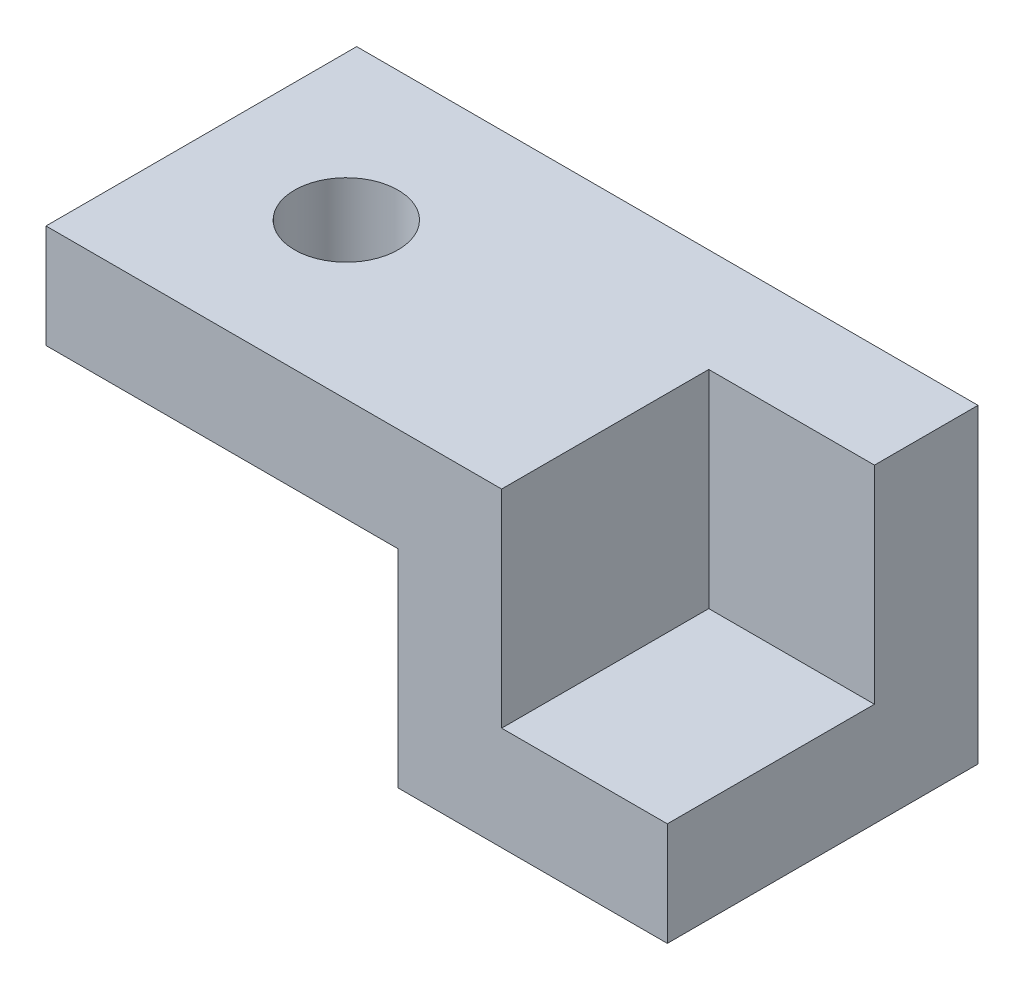
ISO-10303-21;
HEADER;
FILE_DESCRIPTION(('STEP AP214'),'2;1');
FILE_NAME('part.step','',(''),(''),'','','');
FILE_SCHEMA(('AUTOMOTIVE_DESIGN { 1 0 10303 214 1 1 1 1 }'));
ENDSEC;
DATA;
#1=APPLICATION_CONTEXT('core data for automotive mechanical design processes');
#2=APPLICATION_PROTOCOL_DEFINITION('international standard','automotive_design',2000,#1);
#3=PRODUCT_CONTEXT('',#1,'mechanical');
#4=PRODUCT('Part','Part','',(#3));
#5=PRODUCT_RELATED_PRODUCT_CATEGORY('part','',(#4));
#6=PRODUCT_DEFINITION_FORMATION('','',#4);
#7=PRODUCT_DEFINITION_CONTEXT('part definition',#1,'design');
#8=PRODUCT_DEFINITION('design','',#6,#7);
#9=PRODUCT_DEFINITION_SHAPE('','',#8);
#10=(LENGTH_UNIT() NAMED_UNIT(*) SI_UNIT(.MILLI.,.METRE.));
#11=(NAMED_UNIT(*) PLANE_ANGLE_UNIT() SI_UNIT($,.RADIAN.));
#12=(NAMED_UNIT(*) SI_UNIT($,.STERADIAN.) SOLID_ANGLE_UNIT());
#13=UNCERTAINTY_MEASURE_WITH_UNIT(LENGTH_MEASURE(1.E-05),#10,'distance_accuracy_value','');
#14=(GEOMETRIC_REPRESENTATION_CONTEXT(3) GLOBAL_UNCERTAINTY_ASSIGNED_CONTEXT((#13)) GLOBAL_UNIT_ASSIGNED_CONTEXT((#10,
#11,#12)) REPRESENTATION_CONTEXT('',''));
#15=CARTESIAN_POINT('',(0.,0.,0.));
#16=DIRECTION('',(0.,0.,1.));
#17=DIRECTION('',(1.,0.,0.));
#18=AXIS2_PLACEMENT_3D('',#15,#16,#17);
#19=CARTESIAN_POINT('',(0.,75.,0.));
#20=DIRECTION('',(0.,0.,1.));
#21=DIRECTION('',(1.,0.,0.));
#22=AXIS2_PLACEMENT_3D('',#19,#20,#21);
#23=PLANE('',#22);
#24=DIRECTION('',(-1.,0.,0.));
#25=VECTOR('',#24,1.);
#26=CARTESIAN_POINT('',(0.,50.,0.));
#27=LINE('',#26,#25);
#28=CARTESIAN_POINT('',(-65.,50.,0.));
#29=VERTEX_POINT('',#28);
#30=CARTESIAN_POINT('',(-150.,50.,0.));
#31=VERTEX_POINT('',#30);
#32=EDGE_CURVE('E178',#29,#31,#27,.T.);
#33=ORIENTED_EDGE('',*,*,#32,.T.);
#34=DIRECTION('',(0.,-1.,0.));
#35=VECTOR('',#34,1.);
#36=CARTESIAN_POINT('',(-150.,75.,0.));
#37=LINE('',#36,#35);
#38=CARTESIAN_POINT('',(-150.,75.,0.));
#39=VERTEX_POINT('',#38);
#40=EDGE_CURVE('E11',#39,#31,#37,.T.);
#41=ORIENTED_EDGE('',*,*,#40,.F.);
#42=DIRECTION('',(-1.,0.,0.));
#43=VECTOR('',#42,1.);
#44=CARTESIAN_POINT('',(0.,75.,0.));
#45=LINE('',#44,#43);
#46=CARTESIAN_POINT('',(0.,75.,0.));
#47=VERTEX_POINT('',#46);
#48=EDGE_CURVE('E164',#47,#39,#45,.T.);
#49=ORIENTED_EDGE('',*,*,#48,.F.);
#50=DIRECTION('',(0.,-1.,0.));
#51=VECTOR('',#50,1.);
#52=CARTESIAN_POINT('',(0.,75.,0.));
#53=LINE('',#52,#51);
#54=CARTESIAN_POINT('',(0.,0.,0.));
#55=VERTEX_POINT('',#54);
#56=EDGE_CURVE('E141',#47,#55,#53,.T.);
#57=ORIENTED_EDGE('',*,*,#56,.T.);
#58=DIRECTION('',(-1.,0.,0.));
#59=VECTOR('',#58,1.);
#60=CARTESIAN_POINT('',(0.,0.,0.));
#61=LINE('',#60,#59);
#62=CARTESIAN_POINT('',(-65.,0.,0.));
#63=VERTEX_POINT('',#62);
#64=EDGE_CURVE('E133',#55,#63,#61,.T.);
#65=ORIENTED_EDGE('',*,*,#64,.T.);
#66=DIRECTION('',(0.,-1.,0.));
#67=VECTOR('',#66,1.);
#68=CARTESIAN_POINT('',(-65.,75.,0.));
#69=LINE('',#68,#67);
#70=EDGE_CURVE('E157',#29,#63,#69,.T.);
#71=ORIENTED_EDGE('',*,*,#70,.F.);
#72=EDGE_LOOP('',(#33,#41,#49,#57,#65,#71));
#73=FACE_BOUND('',#72,.T.);
#74=ADVANCED_FACE('F39',(#73),#23,.F.);
#75=CARTESIAN_POINT('',(-150.,75.,0.));
#76=DIRECTION('',(1.,0.,0.));
#77=DIRECTION('',(0.,0.,-1.));
#78=AXIS2_PLACEMENT_3D('',#75,#76,#77);
#79=PLANE('',#78);
#80=DIRECTION('',(0.,0.,1.));
#81=VECTOR('',#80,1.);
#82=CARTESIAN_POINT('',(-150.,50.,0.));
#83=LINE('',#82,#81);
#84=CARTESIAN_POINT('',(-150.,50.,75.));
#85=VERTEX_POINT('',#84);
#86=EDGE_CURVE('E185',#31,#85,#83,.T.);
#87=ORIENTED_EDGE('',*,*,#86,.T.);
#88=DIRECTION('',(0.,-1.,0.));
#89=VECTOR('',#88,1.);
#90=CARTESIAN_POINT('',(-150.,75.,75.));
#91=LINE('',#90,#89);
#92=CARTESIAN_POINT('',(-150.,75.,75.));
#93=VERTEX_POINT('',#92);
#94=EDGE_CURVE('E50',#93,#85,#91,.T.);
#95=ORIENTED_EDGE('',*,*,#94,.F.);
#96=DIRECTION('',(0.,0.,1.));
#97=VECTOR('',#96,1.);
#98=CARTESIAN_POINT('',(-150.,75.,0.));
#99=LINE('',#98,#97);
#100=EDGE_CURVE('E166',#39,#93,#99,.T.);
#101=ORIENTED_EDGE('',*,*,#100,.F.);
#102=ORIENTED_EDGE('',*,*,#40,.T.);
#103=EDGE_LOOP('',(#87,#95,#101,#102));
#104=FACE_BOUND('',#103,.T.);
#105=ADVANCED_FACE('F191',(#104),#79,.F.);
#106=CARTESIAN_POINT('',(-115.,75.,37.5));
#107=DIRECTION('',(0.,-1.,0.));
#108=DIRECTION('',(0.,0.,-1.));
#109=AXIS2_PLACEMENT_3D('',#106,#107,#108);
#110=CYLINDRICAL_SURFACE('',#109,12.5);
#111=CARTESIAN_POINT('',(-115.,75.,37.5));
#112=DIRECTION('',(0.,1.,0.));
#113=DIRECTION('',(0.,0.,1.));
#114=AXIS2_PLACEMENT_3D('',#111,#112,#113);
#115=CIRCLE('',#114,12.5);
#116=CARTESIAN_POINT('',(-115.,75.,50.));
#117=VERTEX_POINT('',#116);
#118=EDGE_CURVE('E165',#117,#117,#115,.T.);
#119=ORIENTED_EDGE('',*,*,#118,.T.);
#120=EDGE_LOOP('',(#119));
#121=FACE_BOUND('',#120,.T.);
#122=CARTESIAN_POINT('',(-115.,50.,37.5));
#123=DIRECTION('',(0.,1.,0.));
#124=DIRECTION('',(0.,0.,1.));
#125=AXIS2_PLACEMENT_3D('',#122,#123,#124);
#126=CIRCLE('',#125,12.5);
#127=CARTESIAN_POINT('',(-115.,50.,50.));
#128=VERTEX_POINT('',#127);
#129=EDGE_CURVE('E161',#128,#128,#126,.T.);
#130=ORIENTED_EDGE('',*,*,#129,.F.);
#131=EDGE_LOOP('',(#130));
#132=FACE_BOUND('',#131,.T.);
#133=ADVANCED_FACE('F41',(#121,#132),#110,.F.);
#134=CARTESIAN_POINT('',(0.,75.,75.));
#135=DIRECTION('',(0.,0.,1.));
#136=DIRECTION('',(1.,0.,0.));
#137=AXIS2_PLACEMENT_3D('',#134,#135,#136);
#138=PLANE('',#137);
#139=DIRECTION('',(-1.,0.,0.));
#140=VECTOR('',#139,1.);
#141=CARTESIAN_POINT('',(0.,50.,75.));
#142=LINE('',#141,#140);
#143=CARTESIAN_POINT('',(-65.,50.,75.));
#144=VERTEX_POINT('',#143);
#145=EDGE_CURVE('E167',#144,#85,#142,.T.);
#146=ORIENTED_EDGE('',*,*,#145,.F.);
#147=DIRECTION('',(0.,-1.,0.));
#148=VECTOR('',#147,1.);
#149=CARTESIAN_POINT('',(-65.,75.,75.));
#150=LINE('',#149,#148);
#151=CARTESIAN_POINT('',(-65.,0.,75.));
#152=VERTEX_POINT('',#151);
#153=EDGE_CURVE('E160',#144,#152,#150,.T.);
#154=ORIENTED_EDGE('',*,*,#153,.T.);
#155=DIRECTION('',(-1.,0.,0.));
#156=VECTOR('',#155,1.);
#157=CARTESIAN_POINT('',(0.,0.,75.));
#158=LINE('',#157,#156);
#159=CARTESIAN_POINT('',(0.,0.,75.));
#160=VERTEX_POINT('',#159);
#161=EDGE_CURVE('E149',#160,#152,#158,.T.);
#162=ORIENTED_EDGE('',*,*,#161,.F.);
#163=DIRECTION('',(0.,-1.,0.));
#164=VECTOR('',#163,1.);
#165=CARTESIAN_POINT('',(0.,25.,75.));
#166=LINE('',#165,#164);
#167=CARTESIAN_POINT('',(0.,25.,75.));
#168=VERTEX_POINT('',#167);
#169=EDGE_CURVE('E135',#168,#160,#166,.T.);
#170=ORIENTED_EDGE('',*,*,#169,.F.);
#171=DIRECTION('',(-1.,0.,0.));
#172=VECTOR('',#171,1.);
#173=CARTESIAN_POINT('',(0.,25.,75.));
#174=LINE('',#173,#172);
#175=CARTESIAN_POINT('',(-40.,25.,75.));
#176=VERTEX_POINT('',#175);
#177=EDGE_CURVE('E125',#168,#176,#174,.T.);
#178=ORIENTED_EDGE('',*,*,#177,.T.);
#179=DIRECTION('',(0.,-1.,0.));
#180=VECTOR('',#179,1.);
#181=CARTESIAN_POINT('',(-40.,75.,75.));
#182=LINE('',#181,#180);
#183=CARTESIAN_POINT('',(-40.,75.,75.));
#184=VERTEX_POINT('',#183);
#185=EDGE_CURVE('E53',#184,#176,#182,.T.);
#186=ORIENTED_EDGE('',*,*,#185,.F.);
#187=DIRECTION('',(-1.,0.,0.));
#188=VECTOR('',#187,1.);
#189=CARTESIAN_POINT('',(0.,75.,75.));
#190=LINE('',#189,#188);
#191=EDGE_CURVE('E172',#184,#93,#190,.T.);
#192=ORIENTED_EDGE('',*,*,#191,.T.);
#193=ORIENTED_EDGE('',*,*,#94,.T.);
#194=EDGE_LOOP('',(#146,#154,#162,#170,#178,#186,#192,#193));
#195=FACE_BOUND('',#194,.T.);
#196=ADVANCED_FACE('F186',(#195),#138,.T.);
#197=CARTESIAN_POINT('',(0.,75.,0.));
#198=DIRECTION('',(0.,1.,0.));
#199=DIRECTION('',(0.,0.,1.));
#200=AXIS2_PLACEMENT_3D('',#197,#198,#199);
#201=PLANE('',#200);
#202=ORIENTED_EDGE('',*,*,#118,.F.);
#203=EDGE_LOOP('',(#202));
#204=FACE_BOUND('',#203,.T.);
#205=ORIENTED_EDGE('',*,*,#191,.F.);
#206=DIRECTION('',(0.,0.,1.));
#207=VECTOR('',#206,1.);
#208=CARTESIAN_POINT('',(-40.,75.,0.));
#209=LINE('',#208,#207);
#210=CARTESIAN_POINT('',(-40.,75.,25.));
#211=VERTEX_POINT('',#210);
#212=EDGE_CURVE('E136',#211,#184,#209,.T.);
#213=ORIENTED_EDGE('',*,*,#212,.F.);
#214=DIRECTION('',(-1.,0.,0.));
#215=VECTOR('',#214,1.);
#216=CARTESIAN_POINT('',(0.,75.,25.));
#217=LINE('',#216,#215);
#218=CARTESIAN_POINT('',(0.,75.,25.));
#219=VERTEX_POINT('',#218);
#220=EDGE_CURVE('E114',#219,#211,#217,.T.);
#221=ORIENTED_EDGE('',*,*,#220,.F.);
#222=DIRECTION('',(0.,0.,1.));
#223=VECTOR('',#222,1.);
#224=CARTESIAN_POINT('',(0.,75.,0.));
#225=LINE('',#224,#223);
#226=EDGE_CURVE('E139',#47,#219,#225,.T.);
#227=ORIENTED_EDGE('',*,*,#226,.F.);
#228=ORIENTED_EDGE('',*,*,#48,.T.);
#229=ORIENTED_EDGE('',*,*,#100,.T.);
#230=EDGE_LOOP('',(#205,#213,#221,#227,#228,#229));
#231=FACE_BOUND('',#230,.T.);
#232=ADVANCED_FACE('F209',(#204,#231),#201,.T.);
#233=CARTESIAN_POINT('',(0.,50.,0.));
#234=DIRECTION('',(0.,1.,0.));
#235=DIRECTION('',(0.,0.,1.));
#236=AXIS2_PLACEMENT_3D('',#233,#234,#235);
#237=PLANE('',#236);
#238=ORIENTED_EDGE('',*,*,#129,.T.);
#239=EDGE_LOOP('',(#238));
#240=FACE_BOUND('',#239,.T.);
#241=DIRECTION('',(0.,0.,1.));
#242=VECTOR('',#241,1.);
#243=CARTESIAN_POINT('',(-65.,50.,0.));
#244=LINE('',#243,#242);
#245=EDGE_CURVE('E176',#29,#144,#244,.T.);
#246=ORIENTED_EDGE('',*,*,#245,.T.);
#247=ORIENTED_EDGE('',*,*,#145,.T.);
#248=ORIENTED_EDGE('',*,*,#86,.F.);
#249=ORIENTED_EDGE('',*,*,#32,.F.);
#250=EDGE_LOOP('',(#246,#247,#248,#249));
#251=FACE_BOUND('',#250,.T.);
#252=ADVANCED_FACE('F194',(#240,#251),#237,.F.);
#253=CARTESIAN_POINT('',(-65.,75.,0.));
#254=DIRECTION('',(1.,0.,0.));
#255=DIRECTION('',(0.,0.,-1.));
#256=AXIS2_PLACEMENT_3D('',#253,#254,#255);
#257=PLANE('',#256);
#258=ORIENTED_EDGE('',*,*,#245,.F.);
#259=ORIENTED_EDGE('',*,*,#70,.T.);
#260=DIRECTION('',(0.,0.,1.));
#261=VECTOR('',#260,1.);
#262=CARTESIAN_POINT('',(-65.,0.,0.));
#263=LINE('',#262,#261);
#264=EDGE_CURVE('E148',#63,#152,#263,.T.);
#265=ORIENTED_EDGE('',*,*,#264,.T.);
#266=ORIENTED_EDGE('',*,*,#153,.F.);
#267=EDGE_LOOP('',(#258,#259,#265,#266));
#268=FACE_BOUND('',#267,.T.);
#269=ADVANCED_FACE('F196',(#268),#257,.F.);
#270=CARTESIAN_POINT('',(-40.,75.,0.));
#271=DIRECTION('',(1.,0.,0.));
#272=DIRECTION('',(0.,0.,-1.));
#273=AXIS2_PLACEMENT_3D('',#270,#271,#272);
#274=PLANE('',#273);
#275=DIRECTION('',(0.,0.,1.));
#276=VECTOR('',#275,1.);
#277=CARTESIAN_POINT('',(-40.,25.,0.));
#278=LINE('',#277,#276);
#279=CARTESIAN_POINT('',(-40.,25.,25.));
#280=VERTEX_POINT('',#279);
#281=EDGE_CURVE('E120',#280,#176,#278,.T.);
#282=ORIENTED_EDGE('',*,*,#281,.F.);
#283=DIRECTION('',(0.,-1.,0.));
#284=VECTOR('',#283,1.);
#285=CARTESIAN_POINT('',(-40.,75.,25.));
#286=LINE('',#285,#284);
#287=EDGE_CURVE('E109',#211,#280,#286,.T.);
#288=ORIENTED_EDGE('',*,*,#287,.F.);
#289=ORIENTED_EDGE('',*,*,#212,.T.);
#290=ORIENTED_EDGE('',*,*,#185,.T.);
#291=EDGE_LOOP('',(#282,#288,#289,#290));
#292=FACE_BOUND('',#291,.T.);
#293=ADVANCED_FACE('F119',(#292),#274,.T.);
#294=CARTESIAN_POINT('',(0.,75.,25.));
#295=DIRECTION('',(0.,0.,1.));
#296=DIRECTION('',(1.,0.,0.));
#297=AXIS2_PLACEMENT_3D('',#294,#295,#296);
#298=PLANE('',#297);
#299=DIRECTION('',(-1.,0.,0.));
#300=VECTOR('',#299,1.);
#301=CARTESIAN_POINT('',(0.,25.,25.));
#302=LINE('',#301,#300);
#303=CARTESIAN_POINT('',(0.,25.,25.));
#304=VERTEX_POINT('',#303);
#305=EDGE_CURVE('E65',#304,#280,#302,.T.);
#306=ORIENTED_EDGE('',*,*,#305,.F.);
#307=DIRECTION('',(0.,-1.,0.));
#308=VECTOR('',#307,1.);
#309=CARTESIAN_POINT('',(0.,75.,25.));
#310=LINE('',#309,#308);
#311=EDGE_CURVE('E113',#219,#304,#310,.T.);
#312=ORIENTED_EDGE('',*,*,#311,.F.);
#313=ORIENTED_EDGE('',*,*,#220,.T.);
#314=ORIENTED_EDGE('',*,*,#287,.T.);
#315=EDGE_LOOP('',(#306,#312,#313,#314));
#316=FACE_BOUND('',#315,.T.);
#317=ADVANCED_FACE('F112',(#316),#298,.T.);
#318=CARTESIAN_POINT('',(0.,75.,0.));
#319=DIRECTION('',(1.,0.,0.));
#320=DIRECTION('',(0.,0.,-1.));
#321=AXIS2_PLACEMENT_3D('',#318,#319,#320);
#322=PLANE('',#321);
#323=DIRECTION('',(0.,0.,1.));
#324=VECTOR('',#323,1.);
#325=CARTESIAN_POINT('',(0.,0.,0.));
#326=LINE('',#325,#324);
#327=EDGE_CURVE('E137',#55,#160,#326,.T.);
#328=ORIENTED_EDGE('',*,*,#327,.F.);
#329=ORIENTED_EDGE('',*,*,#56,.F.);
#330=ORIENTED_EDGE('',*,*,#226,.T.);
#331=ORIENTED_EDGE('',*,*,#311,.T.);
#332=DIRECTION('',(0.,0.,1.));
#333=VECTOR('',#332,1.);
#334=CARTESIAN_POINT('',(0.,25.,0.));
#335=LINE('',#334,#333);
#336=EDGE_CURVE('E130',#304,#168,#335,.T.);
#337=ORIENTED_EDGE('',*,*,#336,.T.);
#338=ORIENTED_EDGE('',*,*,#169,.T.);
#339=EDGE_LOOP('',(#328,#329,#330,#331,#337,#338));
#340=FACE_BOUND('',#339,.T.);
#341=ADVANCED_FACE('F210',(#340),#322,.T.);
#342=CARTESIAN_POINT('',(0.,0.,0.));
#343=DIRECTION('',(0.,1.,0.));
#344=DIRECTION('',(0.,0.,1.));
#345=AXIS2_PLACEMENT_3D('',#342,#343,#344);
#346=PLANE('',#345);
#347=ORIENTED_EDGE('',*,*,#327,.T.);
#348=ORIENTED_EDGE('',*,*,#161,.T.);
#349=ORIENTED_EDGE('',*,*,#264,.F.);
#350=ORIENTED_EDGE('',*,*,#64,.F.);
#351=EDGE_LOOP('',(#347,#348,#349,#350));
#352=FACE_BOUND('',#351,.T.);
#353=ADVANCED_FACE('F202',(#352),#346,.F.);
#354=CARTESIAN_POINT('',(0.,25.,0.));
#355=DIRECTION('',(0.,1.,0.));
#356=DIRECTION('',(0.,0.,1.));
#357=AXIS2_PLACEMENT_3D('',#354,#355,#356);
#358=PLANE('',#357);
#359=ORIENTED_EDGE('',*,*,#305,.T.);
#360=ORIENTED_EDGE('',*,*,#281,.T.);
#361=ORIENTED_EDGE('',*,*,#177,.F.);
#362=ORIENTED_EDGE('',*,*,#336,.F.);
#363=EDGE_LOOP('',(#359,#360,#361,#362));
#364=FACE_BOUND('',#363,.T.);
#365=ADVANCED_FACE('F124',(#364),#358,.T.);
#366=CLOSED_SHELL('',(#74,#105,#133,#196,#232,#252,#269,#293,#317,#341,#353,#365));
#367=MANIFOLD_SOLID_BREP('B2',#366);
#368=ADVANCED_BREP_SHAPE_REPRESENTATION('',(#18,#367),#14);
#369=SHAPE_DEFINITION_REPRESENTATION(#9,#368);
ENDSEC;
END-ISO-10303-21;
